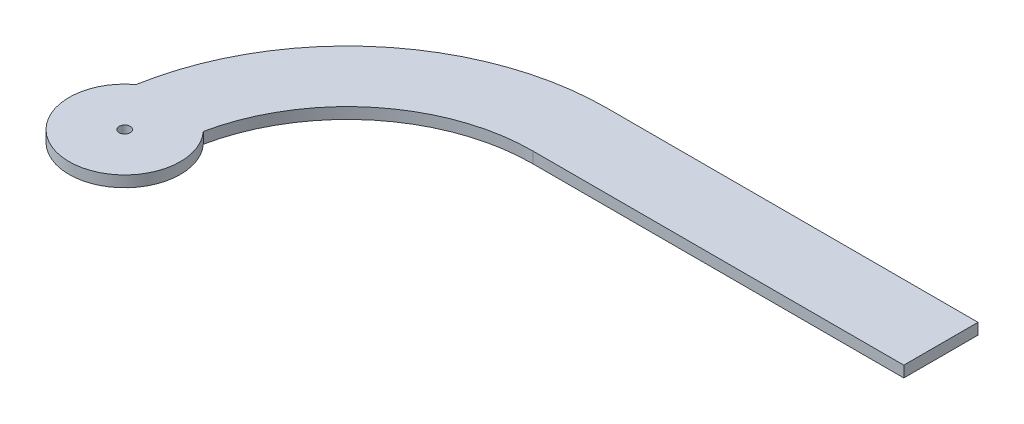
ISO-10303-21;
HEADER;
FILE_DESCRIPTION(('STEP AP214'),'2;1');
FILE_NAME('part.step','',(''),(''),'','','');
FILE_SCHEMA(('AUTOMOTIVE_DESIGN { 1 0 10303 214 1 1 1 1 }'));
ENDSEC;
DATA;
#1=APPLICATION_CONTEXT('core data for automotive mechanical design processes');
#2=APPLICATION_PROTOCOL_DEFINITION('international standard','automotive_design',2000,#1);
#3=PRODUCT_CONTEXT('',#1,'mechanical');
#4=PRODUCT('Part','Part','',(#3));
#5=PRODUCT_RELATED_PRODUCT_CATEGORY('part','',(#4));
#6=PRODUCT_DEFINITION_FORMATION('','',#4);
#7=PRODUCT_DEFINITION_CONTEXT('part definition',#1,'design');
#8=PRODUCT_DEFINITION('design','',#6,#7);
#9=PRODUCT_DEFINITION_SHAPE('','',#8);
#10=(LENGTH_UNIT() NAMED_UNIT(*) SI_UNIT(.MILLI.,.METRE.));
#11=(NAMED_UNIT(*) PLANE_ANGLE_UNIT() SI_UNIT($,.RADIAN.));
#12=(NAMED_UNIT(*) SI_UNIT($,.STERADIAN.) SOLID_ANGLE_UNIT());
#13=UNCERTAINTY_MEASURE_WITH_UNIT(LENGTH_MEASURE(1.E-05),#10,'distance_accuracy_value','');
#14=(GEOMETRIC_REPRESENTATION_CONTEXT(3) GLOBAL_UNCERTAINTY_ASSIGNED_CONTEXT((#13)) GLOBAL_UNIT_ASSIGNED_CONTEXT((#10,
#11,#12)) REPRESENTATION_CONTEXT('',''));
#15=CARTESIAN_POINT('',(0.,0.,0.));
#16=DIRECTION('',(0.,0.,1.));
#17=DIRECTION('',(1.,0.,0.));
#18=AXIS2_PLACEMENT_3D('',#15,#16,#17);
#19=CARTESIAN_POINT('',(-60.,3.,0.));
#20=DIRECTION('',(0.,1.,0.));
#21=DIRECTION('',(0.,0.,1.));
#22=AXIS2_PLACEMENT_3D('',#19,#20,#21);
#23=PLANE('',#22);
#24=CARTESIAN_POINT('',(-60.,3.,0.));
#25=DIRECTION('',(0.,1.,0.));
#26=DIRECTION('',(0.,0.,1.));
#27=AXIS2_PLACEMENT_3D('',#24,#25,#26);
#28=CIRCLE('',#27,15.);
#29=CARTESIAN_POINT('',(-68.9583333333333,3.,-12.0311372649841));
#30=VERTEX_POINT('',#29);
#31=CARTESIAN_POINT('',(-48.9583333333333,3.,-10.1529107758427));
#32=VERTEX_POINT('',#31);
#33=EDGE_CURVE('E129',#30,#32,#28,.T.);
#34=ORIENTED_EDGE('',*,*,#33,.T.);
#35=CARTESIAN_POINT('',(0.,3.,0.));
#36=DIRECTION('',(0.,-1.,0.));
#37=DIRECTION('',(0.,0.,1.));
#38=AXIS2_PLACEMENT_3D('',#35,#36,#37);
#39=CIRCLE('',#38,50.);
#40=CARTESIAN_POINT('',(0.,3.,-50.));
#41=VERTEX_POINT('',#40);
#42=EDGE_CURVE('E87',#32,#41,#39,.T.);
#43=ORIENTED_EDGE('',*,*,#42,.T.);
#44=DIRECTION('',(1.,0.,0.));
#45=VECTOR('',#44,1.);
#46=CARTESIAN_POINT('',(0.,3.,-50.));
#47=LINE('',#46,#45);
#48=CARTESIAN_POINT('',(100.,3.,-50.));
#49=VERTEX_POINT('',#48);
#50=EDGE_CURVE('E100',#41,#49,#47,.T.);
#51=ORIENTED_EDGE('',*,*,#50,.T.);
#52=DIRECTION('',(0.,0.,-1.));
#53=VECTOR('',#52,1.);
#54=CARTESIAN_POINT('',(100.,3.,-50.));
#55=LINE('',#54,#53);
#56=CARTESIAN_POINT('',(100.,3.,-70.));
#57=VERTEX_POINT('',#56);
#58=EDGE_CURVE('E94',#49,#57,#55,.T.);
#59=ORIENTED_EDGE('',*,*,#58,.T.);
#60=DIRECTION('',(-1.,0.,0.));
#61=VECTOR('',#60,1.);
#62=CARTESIAN_POINT('',(100.,3.,-70.));
#63=LINE('',#62,#61);
#64=CARTESIAN_POINT('',(0.,3.,-70.));
#65=VERTEX_POINT('',#64);
#66=EDGE_CURVE('E98',#57,#65,#63,.T.);
#67=ORIENTED_EDGE('',*,*,#66,.T.);
#68=CARTESIAN_POINT('',(0.,3.,0.));
#69=DIRECTION('',(0.,1.,0.));
#70=DIRECTION('',(0.,0.,1.));
#71=AXIS2_PLACEMENT_3D('',#68,#69,#70);
#72=CIRCLE('',#71,70.);
#73=EDGE_CURVE('E50',#65,#30,#72,.T.);
#74=ORIENTED_EDGE('',*,*,#73,.T.);
#75=EDGE_LOOP('',(#34,#43,#51,#59,#67,#74));
#76=FACE_BOUND('',#75,.T.);
#77=CARTESIAN_POINT('',(-60.,3.,0.));
#78=DIRECTION('',(0.,1.,0.));
#79=DIRECTION('',(0.,0.,1.));
#80=AXIS2_PLACEMENT_3D('',#77,#78,#79);
#81=CIRCLE('',#80,1.5);
#82=CARTESIAN_POINT('',(-60.,3.,1.5));
#83=VERTEX_POINT('',#82);
#84=EDGE_CURVE('E122',#83,#83,#81,.T.);
#85=ORIENTED_EDGE('',*,*,#84,.F.);
#86=EDGE_LOOP('',(#85));
#87=FACE_BOUND('',#86,.T.);
#88=ADVANCED_FACE('F33',(#76,#87),#23,.T.);
#89=CARTESIAN_POINT('',(-60.,0.,0.));
#90=DIRECTION('',(0.,1.,0.));
#91=DIRECTION('',(0.,0.,1.));
#92=AXIS2_PLACEMENT_3D('',#89,#90,#91);
#93=PLANE('',#92);
#94=CARTESIAN_POINT('',(-60.,0.,0.));
#95=DIRECTION('',(0.,1.,0.));
#96=DIRECTION('',(0.,0.,1.));
#97=AXIS2_PLACEMENT_3D('',#94,#95,#96);
#98=CIRCLE('',#97,15.);
#99=CARTESIAN_POINT('',(-68.9583333333333,0.,-12.0311372649841));
#100=VERTEX_POINT('',#99);
#101=CARTESIAN_POINT('',(-48.9583333333333,0.,-10.1529107758427));
#102=VERTEX_POINT('',#101);
#103=EDGE_CURVE('E118',#100,#102,#98,.T.);
#104=ORIENTED_EDGE('',*,*,#103,.F.);
#105=CARTESIAN_POINT('',(0.,0.,0.));
#106=DIRECTION('',(0.,1.,0.));
#107=DIRECTION('',(0.,0.,1.));
#108=AXIS2_PLACEMENT_3D('',#105,#106,#107);
#109=CIRCLE('',#108,70.);
#110=CARTESIAN_POINT('',(0.,0.,-70.));
#111=VERTEX_POINT('',#110);
#112=EDGE_CURVE('E79',#111,#100,#109,.T.);
#113=ORIENTED_EDGE('',*,*,#112,.F.);
#114=DIRECTION('',(-1.,0.,0.));
#115=VECTOR('',#114,1.);
#116=CARTESIAN_POINT('',(100.,0.,-70.));
#117=LINE('',#116,#115);
#118=CARTESIAN_POINT('',(100.,0.,-70.));
#119=VERTEX_POINT('',#118);
#120=EDGE_CURVE('E73',#119,#111,#117,.T.);
#121=ORIENTED_EDGE('',*,*,#120,.F.);
#122=DIRECTION('',(0.,0.,-1.));
#123=VECTOR('',#122,1.);
#124=CARTESIAN_POINT('',(100.,0.,-50.));
#125=LINE('',#124,#123);
#126=CARTESIAN_POINT('',(100.,0.,-50.));
#127=VERTEX_POINT('',#126);
#128=EDGE_CURVE('E108',#127,#119,#125,.T.);
#129=ORIENTED_EDGE('',*,*,#128,.F.);
#130=DIRECTION('',(1.,0.,0.));
#131=VECTOR('',#130,1.);
#132=CARTESIAN_POINT('',(0.,0.,-50.));
#133=LINE('',#132,#131);
#134=CARTESIAN_POINT('',(0.,0.,-50.));
#135=VERTEX_POINT('',#134);
#136=EDGE_CURVE('E124',#135,#127,#133,.T.);
#137=ORIENTED_EDGE('',*,*,#136,.F.);
#138=CARTESIAN_POINT('',(0.,0.,0.));
#139=DIRECTION('',(0.,-1.,0.));
#140=DIRECTION('',(0.,0.,1.));
#141=AXIS2_PLACEMENT_3D('',#138,#139,#140);
#142=CIRCLE('',#141,50.);
#143=EDGE_CURVE('E121',#102,#135,#142,.T.);
#144=ORIENTED_EDGE('',*,*,#143,.F.);
#145=EDGE_LOOP('',(#104,#113,#121,#129,#137,#144));
#146=FACE_BOUND('',#145,.T.);
#147=CARTESIAN_POINT('',(-60.,0.,0.));
#148=DIRECTION('',(0.,1.,0.));
#149=DIRECTION('',(0.,0.,1.));
#150=AXIS2_PLACEMENT_3D('',#147,#148,#149);
#151=CIRCLE('',#150,1.5);
#152=CARTESIAN_POINT('',(-60.,0.,1.5));
#153=VERTEX_POINT('',#152);
#154=EDGE_CURVE('E222',#153,#153,#151,.T.);
#155=ORIENTED_EDGE('',*,*,#154,.T.);
#156=EDGE_LOOP('',(#155));
#157=FACE_BOUND('',#156,.T.);
#158=ADVANCED_FACE('F138',(#146,#157),#93,.F.);
#159=CARTESIAN_POINT('',(-60.,3.,0.));
#160=DIRECTION('',(0.,-1.,0.));
#161=DIRECTION('',(0.,0.,-1.));
#162=AXIS2_PLACEMENT_3D('',#159,#160,#161);
#163=CYLINDRICAL_SURFACE('',#162,15.);
#164=ORIENTED_EDGE('',*,*,#103,.T.);
#165=DIRECTION('',(0.,-1.,0.));
#166=VECTOR('',#165,1.);
#167=CARTESIAN_POINT('',(-48.9583333333333,3.,-10.1529107758427));
#168=LINE('',#167,#166);
#169=EDGE_CURVE('E11',#32,#102,#168,.T.);
#170=ORIENTED_EDGE('',*,*,#169,.F.);
#171=ORIENTED_EDGE('',*,*,#33,.F.);
#172=DIRECTION('',(0.,-1.,0.));
#173=VECTOR('',#172,1.);
#174=CARTESIAN_POINT('',(-68.9583333333333,3.,-12.0311372649841));
#175=LINE('',#174,#173);
#176=EDGE_CURVE('E114',#30,#100,#175,.T.);
#177=ORIENTED_EDGE('',*,*,#176,.T.);
#178=EDGE_LOOP('',(#164,#170,#171,#177));
#179=FACE_BOUND('',#178,.T.);
#180=ADVANCED_FACE('F35',(#179),#163,.T.);
#181=CARTESIAN_POINT('',(0.,3.,0.));
#182=DIRECTION('',(0.,-1.,0.));
#183=DIRECTION('',(0.,0.,-1.));
#184=AXIS2_PLACEMENT_3D('',#181,#182,#183);
#185=CYLINDRICAL_SURFACE('',#184,50.);
#186=ORIENTED_EDGE('',*,*,#143,.T.);
#187=DIRECTION('',(0.,-1.,0.));
#188=VECTOR('',#187,1.);
#189=CARTESIAN_POINT('',(0.,3.,-50.));
#190=LINE('',#189,#188);
#191=EDGE_CURVE('E42',#41,#135,#190,.T.);
#192=ORIENTED_EDGE('',*,*,#191,.F.);
#193=ORIENTED_EDGE('',*,*,#42,.F.);
#194=ORIENTED_EDGE('',*,*,#169,.T.);
#195=EDGE_LOOP('',(#186,#192,#193,#194));
#196=FACE_BOUND('',#195,.T.);
#197=ADVANCED_FACE('F163',(#196),#185,.F.);
#198=CARTESIAN_POINT('',(0.,3.,-50.));
#199=DIRECTION('',(0.,0.,-1.));
#200=DIRECTION('',(-1.,0.,0.));
#201=AXIS2_PLACEMENT_3D('',#198,#199,#200);
#202=PLANE('',#201);
#203=ORIENTED_EDGE('',*,*,#136,.T.);
#204=DIRECTION('',(0.,-1.,0.));
#205=VECTOR('',#204,1.);
#206=CARTESIAN_POINT('',(100.,3.,-50.));
#207=LINE('',#206,#205);
#208=EDGE_CURVE('E109',#49,#127,#207,.T.);
#209=ORIENTED_EDGE('',*,*,#208,.F.);
#210=ORIENTED_EDGE('',*,*,#50,.F.);
#211=ORIENTED_EDGE('',*,*,#191,.T.);
#212=EDGE_LOOP('',(#203,#209,#210,#211));
#213=FACE_BOUND('',#212,.T.);
#214=ADVANCED_FACE('F135',(#213),#202,.F.);
#215=CARTESIAN_POINT('',(100.,3.,-50.));
#216=DIRECTION('',(-1.,0.,0.));
#217=DIRECTION('',(0.,0.,1.));
#218=AXIS2_PLACEMENT_3D('',#215,#216,#217);
#219=PLANE('',#218);
#220=ORIENTED_EDGE('',*,*,#128,.T.);
#221=DIRECTION('',(0.,-1.,0.));
#222=VECTOR('',#221,1.);
#223=CARTESIAN_POINT('',(100.,3.,-70.));
#224=LINE('',#223,#222);
#225=EDGE_CURVE('E105',#57,#119,#224,.T.);
#226=ORIENTED_EDGE('',*,*,#225,.F.);
#227=ORIENTED_EDGE('',*,*,#58,.F.);
#228=ORIENTED_EDGE('',*,*,#208,.T.);
#229=EDGE_LOOP('',(#220,#226,#227,#228));
#230=FACE_BOUND('',#229,.T.);
#231=ADVANCED_FACE('F106',(#230),#219,.F.);
#232=CARTESIAN_POINT('',(100.,3.,-70.));
#233=DIRECTION('',(0.,0.,1.));
#234=DIRECTION('',(1.,0.,0.));
#235=AXIS2_PLACEMENT_3D('',#232,#233,#234);
#236=PLANE('',#235);
#237=ORIENTED_EDGE('',*,*,#120,.T.);
#238=DIRECTION('',(0.,-1.,0.));
#239=VECTOR('',#238,1.);
#240=CARTESIAN_POINT('',(0.,3.,-70.));
#241=LINE('',#240,#239);
#242=EDGE_CURVE('E110',#65,#111,#241,.T.);
#243=ORIENTED_EDGE('',*,*,#242,.F.);
#244=ORIENTED_EDGE('',*,*,#66,.F.);
#245=ORIENTED_EDGE('',*,*,#225,.T.);
#246=EDGE_LOOP('',(#237,#243,#244,#245));
#247=FACE_BOUND('',#246,.T.);
#248=ADVANCED_FACE('F112',(#247),#236,.F.);
#249=CARTESIAN_POINT('',(0.,3.,0.));
#250=DIRECTION('',(0.,-1.,0.));
#251=DIRECTION('',(0.,0.,-1.));
#252=AXIS2_PLACEMENT_3D('',#249,#250,#251);
#253=CYLINDRICAL_SURFACE('',#252,70.);
#254=ORIENTED_EDGE('',*,*,#112,.T.);
#255=ORIENTED_EDGE('',*,*,#176,.F.);
#256=ORIENTED_EDGE('',*,*,#73,.F.);
#257=ORIENTED_EDGE('',*,*,#242,.T.);
#258=EDGE_LOOP('',(#254,#255,#256,#257));
#259=FACE_BOUND('',#258,.T.);
#260=ADVANCED_FACE('F143',(#259),#253,.T.);
#261=CARTESIAN_POINT('',(-60.,3.,0.));
#262=DIRECTION('',(0.,-1.,0.));
#263=DIRECTION('',(0.,0.,-1.));
#264=AXIS2_PLACEMENT_3D('',#261,#262,#263);
#265=CYLINDRICAL_SURFACE('',#264,1.5);
#266=ORIENTED_EDGE('',*,*,#84,.T.);
#267=EDGE_LOOP('',(#266));
#268=FACE_BOUND('',#267,.T.);
#269=ORIENTED_EDGE('',*,*,#154,.F.);
#270=EDGE_LOOP('',(#269));
#271=FACE_BOUND('',#270,.T.);
#272=ADVANCED_FACE('F145',(#268,#271),#265,.F.);
#273=CLOSED_SHELL('',(#88,#158,#180,#197,#214,#231,#248,#260,#272));
#274=MANIFOLD_SOLID_BREP('B2',#273);
#275=ADVANCED_BREP_SHAPE_REPRESENTATION('',(#18,#274),#14);
#276=SHAPE_DEFINITION_REPRESENTATION(#9,#275);
ENDSEC;
END-ISO-10303-21;
